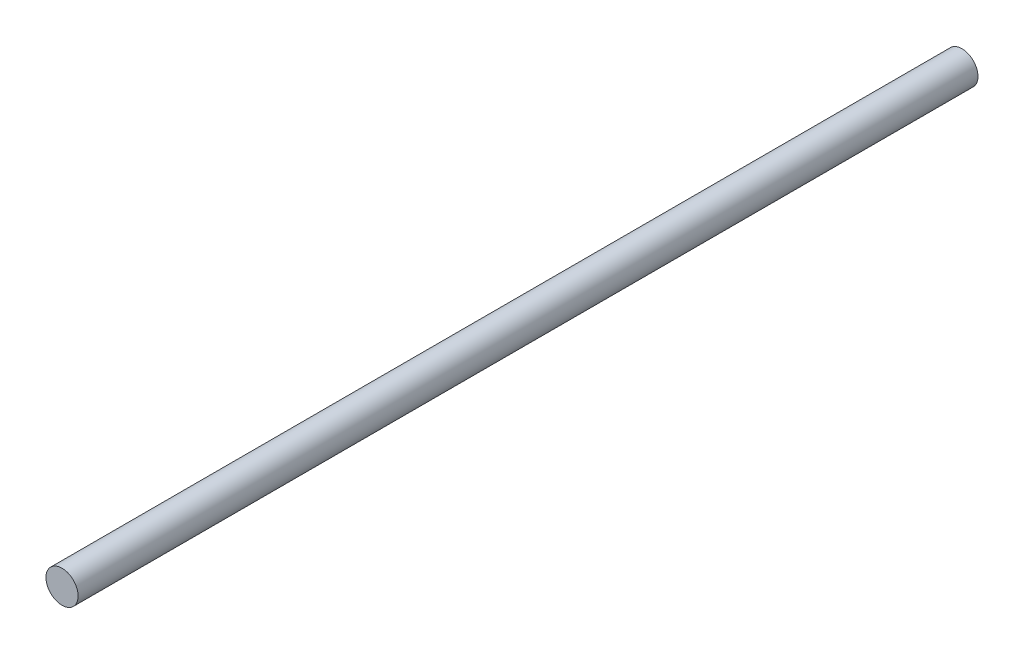
ISO-10303-21;
HEADER;
FILE_DESCRIPTION(('STEP AP214'),'2;1');
FILE_NAME('part.step','',(''),(''),'','','');
FILE_SCHEMA(('AUTOMOTIVE_DESIGN { 1 0 10303 214 1 1 1 1 }'));
ENDSEC;
DATA;
#1=APPLICATION_CONTEXT('core data for automotive mechanical design processes');
#2=APPLICATION_PROTOCOL_DEFINITION('international standard','automotive_design',2000,#1);
#3=PRODUCT_CONTEXT('',#1,'mechanical');
#4=PRODUCT('Part','Part','',(#3));
#5=PRODUCT_RELATED_PRODUCT_CATEGORY('part','',(#4));
#6=PRODUCT_DEFINITION_FORMATION('','',#4);
#7=PRODUCT_DEFINITION_CONTEXT('part definition',#1,'design');
#8=PRODUCT_DEFINITION('design','',#6,#7);
#9=PRODUCT_DEFINITION_SHAPE('','',#8);
#10=(LENGTH_UNIT() NAMED_UNIT(*) SI_UNIT(.MILLI.,.METRE.));
#11=(NAMED_UNIT(*) PLANE_ANGLE_UNIT() SI_UNIT($,.RADIAN.));
#12=(NAMED_UNIT(*) SI_UNIT($,.STERADIAN.) SOLID_ANGLE_UNIT());
#13=UNCERTAINTY_MEASURE_WITH_UNIT(LENGTH_MEASURE(1.E-05),#10,'distance_accuracy_value','');
#14=(GEOMETRIC_REPRESENTATION_CONTEXT(3) GLOBAL_UNCERTAINTY_ASSIGNED_CONTEXT((#13)) GLOBAL_UNIT_ASSIGNED_CONTEXT((#10,
#11,#12)) REPRESENTATION_CONTEXT('',''));
#15=CARTESIAN_POINT('',(0.,0.,0.));
#16=DIRECTION('',(0.,0.,1.));
#17=DIRECTION('',(1.,0.,0.));
#18=AXIS2_PLACEMENT_3D('',#15,#16,#17);
#19=CARTESIAN_POINT('',(0.,0.,700.));
#20=DIRECTION('',(0.,0.,-1.));
#21=DIRECTION('',(-1.,0.,0.));
#22=AXIS2_PLACEMENT_3D('',#19,#20,#21);
#23=CYLINDRICAL_SURFACE('',#22,12.5);
#24=CARTESIAN_POINT('',(0.,0.,700.));
#25=DIRECTION('',(0.,0.,1.));
#26=DIRECTION('',(1.,0.,0.));
#27=AXIS2_PLACEMENT_3D('',#24,#25,#26);
#28=CIRCLE('',#27,12.5);
#29=CARTESIAN_POINT('',(12.5,0.,700.));
#30=VERTEX_POINT('',#29);
#31=EDGE_CURVE('E10',#30,#30,#28,.T.);
#32=ORIENTED_EDGE('',*,*,#31,.F.);
#33=EDGE_LOOP('',(#32));
#34=FACE_BOUND('',#33,.T.);
#35=CARTESIAN_POINT('',(0.,0.,0.));
#36=DIRECTION('',(0.,0.,1.));
#37=DIRECTION('',(1.,0.,0.));
#38=AXIS2_PLACEMENT_3D('',#35,#36,#37);
#39=CIRCLE('',#38,12.5);
#40=CARTESIAN_POINT('',(12.5,0.,0.));
#41=VERTEX_POINT('',#40);
#42=EDGE_CURVE('E39',#41,#41,#39,.T.);
#43=ORIENTED_EDGE('',*,*,#42,.T.);
#44=EDGE_LOOP('',(#43));
#45=FACE_BOUND('',#44,.T.);
#46=ADVANCED_FACE('F36',(#34,#45),#23,.T.);
#47=CARTESIAN_POINT('',(0.,0.,700.));
#48=DIRECTION('',(0.,0.,1.));
#49=DIRECTION('',(1.,0.,0.));
#50=AXIS2_PLACEMENT_3D('',#47,#48,#49);
#51=PLANE('',#50);
#52=ORIENTED_EDGE('',*,*,#31,.T.);
#53=EDGE_LOOP('',(#52));
#54=FACE_BOUND('',#53,.T.);
#55=ADVANCED_FACE('F51',(#54),#51,.T.);
#56=CARTESIAN_POINT('',(0.,0.,0.));
#57=DIRECTION('',(0.,0.,1.));
#58=DIRECTION('',(1.,0.,0.));
#59=AXIS2_PLACEMENT_3D('',#56,#57,#58);
#60=PLANE('',#59);
#61=ORIENTED_EDGE('',*,*,#42,.F.);
#62=EDGE_LOOP('',(#61));
#63=FACE_BOUND('',#62,.T.);
#64=ADVANCED_FACE('F49',(#63),#60,.F.);
#65=CLOSED_SHELL('',(#46,#55,#64));
#66=MANIFOLD_SOLID_BREP('B2',#65);
#67=ADVANCED_BREP_SHAPE_REPRESENTATION('',(#18,#66),#14);
#68=SHAPE_DEFINITION_REPRESENTATION(#9,#67);
ENDSEC;
END-ISO-10303-21;
